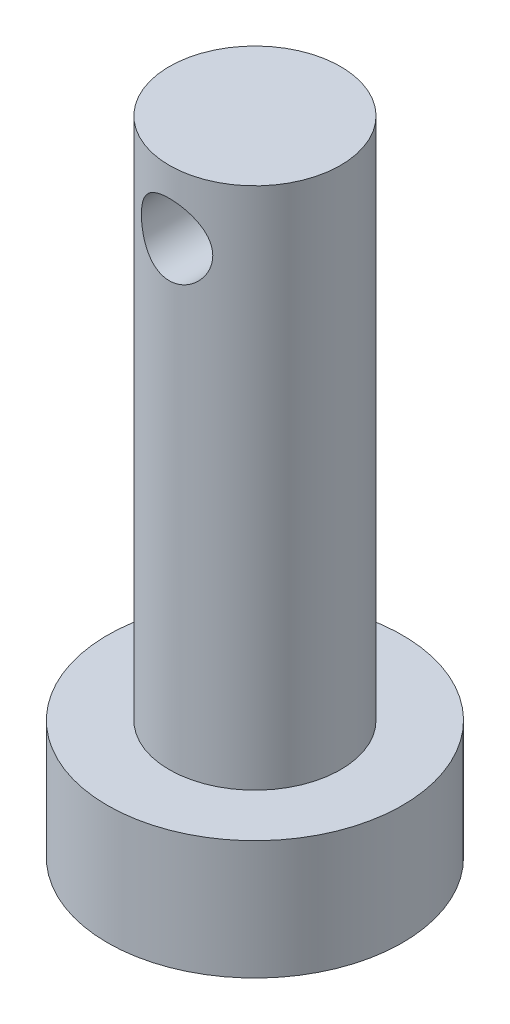
ISO-10303-21;
HEADER;
FILE_DESCRIPTION(('STEP AP214'),'2;1');
FILE_NAME('part.step','',(''),(''),'','','');
FILE_SCHEMA(('AUTOMOTIVE_DESIGN { 1 0 10303 214 1 1 1 1 }'));
ENDSEC;
DATA;
#1=APPLICATION_CONTEXT('core data for automotive mechanical design processes');
#2=APPLICATION_PROTOCOL_DEFINITION('international standard','automotive_design',2000,#1);
#3=PRODUCT_CONTEXT('',#1,'mechanical');
#4=PRODUCT('Part','Part','',(#3));
#5=PRODUCT_RELATED_PRODUCT_CATEGORY('part','',(#4));
#6=PRODUCT_DEFINITION_FORMATION('','',#4);
#7=PRODUCT_DEFINITION_CONTEXT('part definition',#1,'design');
#8=PRODUCT_DEFINITION('design','',#6,#7);
#9=PRODUCT_DEFINITION_SHAPE('','',#8);
#10=(LENGTH_UNIT() NAMED_UNIT(*) SI_UNIT(.MILLI.,.METRE.));
#11=(NAMED_UNIT(*) PLANE_ANGLE_UNIT() SI_UNIT($,.RADIAN.));
#12=(NAMED_UNIT(*) SI_UNIT($,.STERADIAN.) SOLID_ANGLE_UNIT());
#13=UNCERTAINTY_MEASURE_WITH_UNIT(LENGTH_MEASURE(1.E-05),#10,'distance_accuracy_value','');
#14=(GEOMETRIC_REPRESENTATION_CONTEXT(3) GLOBAL_UNCERTAINTY_ASSIGNED_CONTEXT((#13)) GLOBAL_UNIT_ASSIGNED_CONTEXT((#10,
#11,#12)) REPRESENTATION_CONTEXT('',''));
#15=CARTESIAN_POINT('',(0.,0.,0.));
#16=DIRECTION('',(0.,0.,1.));
#17=DIRECTION('',(1.,0.,0.));
#18=AXIS2_PLACEMENT_3D('',#15,#16,#17);
#19=CARTESIAN_POINT('',(0.,2.5,0.));
#20=DIRECTION('',(0.,-1.,0.));
#21=DIRECTION('',(0.,0.,-1.));
#22=AXIS2_PLACEMENT_3D('',#19,#20,#21);
#23=CYLINDRICAL_SURFACE('',#22,3.1);
#24=CARTESIAN_POINT('',(0.,2.5,0.));
#25=DIRECTION('',(0.,1.,0.));
#26=DIRECTION('',(0.,0.,1.));
#27=AXIS2_PLACEMENT_3D('',#24,#25,#26);
#28=CIRCLE('',#27,3.1);
#29=CARTESIAN_POINT('',(0.,2.5,3.1));
#30=VERTEX_POINT('',#29);
#31=EDGE_CURVE('E54',#30,#30,#28,.T.);
#32=ORIENTED_EDGE('',*,*,#31,.F.);
#33=EDGE_LOOP('',(#32));
#34=FACE_BOUND('',#33,.T.);
#35=CARTESIAN_POINT('',(0.,0.,0.));
#36=DIRECTION('',(0.,1.,0.));
#37=DIRECTION('',(0.,0.,1.));
#38=AXIS2_PLACEMENT_3D('',#35,#36,#37);
#39=CIRCLE('',#38,3.1);
#40=CARTESIAN_POINT('',(0.,0.,3.1));
#41=VERTEX_POINT('',#40);
#42=EDGE_CURVE('E60',#41,#41,#39,.T.);
#43=ORIENTED_EDGE('',*,*,#42,.T.);
#44=EDGE_LOOP('',(#43));
#45=FACE_BOUND('',#44,.T.);
#46=ADVANCED_FACE('F41',(#34,#45),#23,.T.);
#47=CARTESIAN_POINT('',(0.,2.5,0.));
#48=DIRECTION('',(0.,1.,0.));
#49=DIRECTION('',(0.,0.,1.));
#50=AXIS2_PLACEMENT_3D('',#47,#48,#49);
#51=PLANE('',#50);
#52=CARTESIAN_POINT('',(0.,2.5,0.));
#53=DIRECTION('',(0.,1.,0.));
#54=DIRECTION('',(0.,0.,1.));
#55=AXIS2_PLACEMENT_3D('',#52,#53,#54);
#56=CIRCLE('',#55,1.8);
#57=CARTESIAN_POINT('',(0.,2.5,1.8));
#58=VERTEX_POINT('',#57);
#59=EDGE_CURVE('E10',#58,#58,#56,.T.);
#60=ORIENTED_EDGE('',*,*,#59,.F.);
#61=EDGE_LOOP('',(#60));
#62=FACE_BOUND('',#61,.T.);
#63=ORIENTED_EDGE('',*,*,#31,.T.);
#64=EDGE_LOOP('',(#63));
#65=FACE_BOUND('',#64,.T.);
#66=ADVANCED_FACE('F92',(#62,#65),#51,.T.);
#67=CARTESIAN_POINT('',(0.,0.,0.));
#68=DIRECTION('',(0.,1.,0.));
#69=DIRECTION('',(0.,0.,1.));
#70=AXIS2_PLACEMENT_3D('',#67,#68,#69);
#71=PLANE('',#70);
#72=ORIENTED_EDGE('',*,*,#42,.F.);
#73=EDGE_LOOP('',(#72));
#74=FACE_BOUND('',#73,.T.);
#75=ADVANCED_FACE('F88',(#74),#71,.F.);
#76=CARTESIAN_POINT('',(0.,13.5,0.));
#77=DIRECTION('',(0.,-1.,0.));
#78=DIRECTION('',(0.,0.,-1.));
#79=AXIS2_PLACEMENT_3D('',#76,#77,#78);
#80=CYLINDRICAL_SURFACE('',#79,1.8);
#81=CARTESIAN_POINT('',(0.,12.9,-1.8));
#82=CARTESIAN_POINT('',(-0.0401748315817601,12.8999956769452,-1.79999675020364));
#83=CARTESIAN_POINT('',(-0.0804128382383045,12.8967528248831,-1.79863939784826));
#84=CARTESIAN_POINT('',(-0.159748422693808,12.8838965610479,-1.79334092147731));
#85=CARTESIAN_POINT('',(-0.198842745854139,12.8742665253215,-1.78939305540617));
#86=CARTESIAN_POINT('',(-0.274613240191853,12.8490533449316,-1.77933773422876));
#87=CARTESIAN_POINT('',(-0.311297114655761,12.8334903663191,-1.77323759985002));
#88=CARTESIAN_POINT('',(-0.381497854007881,12.7969363060605,-1.75947171882398));
#89=CARTESIAN_POINT('',(-0.415015674009564,12.7759468686175,-1.75180644655709));
#90=CARTESIAN_POINT('',(-0.479669042135707,12.7280226104455,-1.73524697011121));
#91=CARTESIAN_POINT('',(-0.510624760510661,12.7008592147261,-1.72631251995656));
#92=CARTESIAN_POINT('',(-0.567695892654757,12.6418413991305,-1.70839628441108));
#93=CARTESIAN_POINT('',(-0.593808757891852,12.6099845250633,-1.69941447664086));
#94=CARTESIAN_POINT('',(-0.641722426182393,12.5405839334611,-1.68192613087797));
#95=CARTESIAN_POINT('',(-0.66324784892355,12.5028375309441,-1.67346472124031));
#96=CARTESIAN_POINT('',(-0.699563643533194,12.4238560452474,-1.65861343414203));
#97=CARTESIAN_POINT('',(-0.714357485017745,12.3826227723093,-1.65222249000494));
#98=CARTESIAN_POINT('',(-0.736047589872953,12.2999077849392,-1.64267133232623));
#99=CARTESIAN_POINT('',(-0.743289947265634,12.2585337099647,-1.63937032591072));
#100=CARTESIAN_POINT('',(-0.750751259806779,12.1750360243881,-1.63596795731702));
#101=CARTESIAN_POINT('',(-0.750974088326384,12.1329128399846,-1.63586483055156));
#102=CARTESIAN_POINT('',(-0.744650702182043,12.052559963739,-1.63875071736511));
#103=CARTESIAN_POINT('',(-0.738622086673805,12.0142793420613,-1.64150329634174));
#104=CARTESIAN_POINT('',(-0.72083514609466,11.9393327453998,-1.64939089664278));
#105=CARTESIAN_POINT('',(-0.709075723723061,11.9026670811049,-1.65452637422138));
#106=CARTESIAN_POINT('',(-0.679931752365426,11.8310653782051,-1.66671710863654));
#107=CARTESIAN_POINT('',(-0.662432829235417,11.796182747452,-1.67381089169482));
#108=CARTESIAN_POINT('',(-0.622387455483375,11.7297133596719,-1.68910998684651));
#109=CARTESIAN_POINT('',(-0.599839014311727,11.6981279096319,-1.69731573677868));
#110=CARTESIAN_POINT('',(-0.548097579326301,11.6363400247603,-1.71475786126788));
#111=CARTESIAN_POINT('',(-0.518504089924515,11.6064800595687,-1.72402272842684));
#112=CARTESIAN_POINT('',(-0.454637754630906,11.5520318982245,-1.74195403867518));
#113=CARTESIAN_POINT('',(-0.420363815669073,11.5274449369847,-1.75062034126206));
#114=CARTESIAN_POINT('',(-0.347068769216026,11.4837385058302,-1.76662970133884));
#115=CARTESIAN_POINT('',(-0.307956349468608,11.4647583329096,-1.77393759926));
#116=CARTESIAN_POINT('',(-0.2267114415161,11.433767316238,-1.78613688848882));
#117=CARTESIAN_POINT('',(-0.184580636877022,11.4217526208337,-1.7910296150748));
#118=CARTESIAN_POINT('',(-0.101356868007738,11.405750404724,-1.79759784711831));
#119=CARTESIAN_POINT('',(-0.0603667711671846,11.4013032855337,-1.79945724628275));
#120=CARTESIAN_POINT('',(0.0218127932976526,11.3991922658315,-1.80033630221247));
#121=CARTESIAN_POINT('',(0.0630022002915806,11.4015264178488,-1.79935677427163));
#122=CARTESIAN_POINT('',(0.142258945404861,11.4125826508836,-1.79478730594164));
#123=CARTESIAN_POINT('',(0.180379779983631,11.4209819724583,-1.79132932370394));
#124=CARTESIAN_POINT('',(0.254629649382654,11.4434809167245,-1.78229164063449));
#125=CARTESIAN_POINT('',(0.290758431911016,11.4575812595702,-1.77671167175822));
#126=CARTESIAN_POINT('',(0.361265399921481,11.4915425854273,-1.76374962387099));
#127=CARTESIAN_POINT('',(0.395554342113194,11.5115689098876,-1.75631694881569));
#128=CARTESIAN_POINT('',(0.460407729738857,11.556632026675,-1.74044282747454));
#129=CARTESIAN_POINT('',(0.490970611561164,11.5816709109176,-1.7320009606124));
#130=CARTESIAN_POINT('',(0.549800058164559,11.6381419399634,-1.71427252737262));
#131=CARTESIAN_POINT('',(0.577746418787902,11.6699031017918,-1.70496870954617));
#132=CARTESIAN_POINT('',(0.628001907663307,11.7378127655612,-1.68710602060803));
#133=CARTESIAN_POINT('',(0.650309755713706,11.773962261103,-1.67854731896063));
#134=CARTESIAN_POINT('',(0.688895761252196,11.8503685051815,-1.66308831746393));
#135=CARTESIAN_POINT('',(0.705083509423974,11.8906764213089,-1.65621337533067));
#136=CARTESIAN_POINT('',(0.730304483709438,11.9738223562861,-1.64525013395374));
#137=CARTESIAN_POINT('',(0.739343609182126,12.01665825749,-1.64115953733451));
#138=CARTESIAN_POINT('',(0.749424482093404,12.1000912195195,-1.63657898722358));
#139=CARTESIAN_POINT('',(0.751028282478776,12.1406067973756,-1.63583610580298));
#140=CARTESIAN_POINT('',(0.747693453143475,12.2213057166847,-1.63736311806614));
#141=CARTESIAN_POINT('',(0.74275582778833,12.2614891081882,-1.63963254924184));
#142=CARTESIAN_POINT('',(0.726950428682948,12.3384556484813,-1.64669730781361));
#143=CARTESIAN_POINT('',(0.716369421428798,12.375310004078,-1.65137012907888));
#144=CARTESIAN_POINT('',(0.689857969212809,12.4467288128143,-1.66261908719513));
#145=CARTESIAN_POINT('',(0.673926021103513,12.4812926192393,-1.66919575879016));
#146=CARTESIAN_POINT('',(0.636061715612939,12.5494175375695,-1.68400172736008));
#147=CARTESIAN_POINT('',(0.613826165462901,12.582793398101,-1.69230661628208));
#148=CARTESIAN_POINT('',(0.564410443578236,12.6455160836164,-1.70942213432303));
#149=CARTESIAN_POINT('',(0.537228557343373,12.6748615053603,-1.71823293807525));
#150=CARTESIAN_POINT('',(0.476341227467294,12.7308892090108,-1.73613835710064));
#151=CARTESIAN_POINT('',(0.442304843969418,12.7572218597044,-1.74520690507075));
#152=CARTESIAN_POINT('',(0.369960047551922,12.8038196721262,-1.76196086173212));
#153=CARTESIAN_POINT('',(0.331649698767449,12.8240820689337,-1.76964563950044));
#154=CARTESIAN_POINT('',(0.252439234030772,12.8575259072639,-1.78265510017476));
#155=CARTESIAN_POINT('',(0.211592394588383,12.8708188599704,-1.78801669549178));
#156=CARTESIAN_POINT('',(0.128046253107936,12.8902237974467,-1.79592605861175));
#157=CARTESIAN_POINT('',(0.0853531901885755,12.8963582655179,-1.7984826348718));
#158=CARTESIAN_POINT('',(0.0283416491515106,12.8995998966519,-1.7998337254136));
#159=CARTESIAN_POINT('',(0.0141747568053946,12.9000015252895,-1.80000114661521));
#160=CARTESIAN_POINT('',(0.,12.9,-1.8));
#161=B_SPLINE_CURVE_WITH_KNOTS('',3,(#81,#82,#83,#84,#85,#86,#87,#88,#89,#90,#91,#92,#93,#94,
#95,#96,#97,#98,#99,#100,#101,#102,#103,#104,#105,#106,#107,#108,#109,#110,#111,#112,#113,#114,
#115,#116,#117,#118,#119,#120,#121,#122,#123,#124,#125,#126,#127,#128,#129,#130,#131,#132,#133,
#134,#135,#136,#137,#138,#139,#140,#141,#142,#143,#144,#145,#146,#147,#148,#149,#150,#151,#152,
#153,#154,#155,#156,#157,#158,#159,#160),.UNSPECIFIED.,.T.,.F.,(4,2,2,2,2,2,2,2,2,2,2,2,2,2,2,2,
2,2,2,2,2,2,2,2,2,2,2,2,2,2,2,2,2,2,2,2,2,2,2,4),(0.,0.120484151330363,0.241283124377218,
0.361675111143782,0.482030662111785,0.607907617732842,0.733850628788793,0.865990347234751,
0.998061880383526,1.12377163882534,1.24941202949428,1.36542094321534,1.48145207836328,
1.59995227835229,1.71849927430324,1.84706484676738,1.97566049588753,2.10722433036488,
2.23871534530978,2.36189066035951,2.48503060495903,2.60205953841433,2.71910325961071,
2.83978281163297,2.96051283281698,3.08987092817577,3.21925836744205,3.35048873015714,
3.48161068244748,3.60263926535786,3.72364926778522,3.83902589978858,3.95443496970368,
4.07678336038465,4.19917424055567,4.33047921002934,4.4618438965715,4.59103713491632,
4.71982350281593,4.76233353899459),.UNSPECIFIED.);
#162=CARTESIAN_POINT('',(0.,12.9,-1.8));
#163=VERTEX_POINT('',#162);
#164=EDGE_CURVE('E44',#163,#163,#161,.T.);
#165=ORIENTED_EDGE('',*,*,#164,.T.);
#166=EDGE_LOOP('',(#165));
#167=FACE_BOUND('',#166,.T.);
#168=CARTESIAN_POINT('',(0.75,12.15,1.63630681719536));
#169=CARTESIAN_POINT('',(0.749995554399406,12.1099968654619,1.63631111737932));
#170=CARTESIAN_POINT('',(0.746779223289017,12.0699284059043,1.6377951572064));
#171=CARTESIAN_POINT('',(0.734038073686708,11.9909478347657,1.6435430019053));
#172=CARTESIAN_POINT('',(0.724496124019659,11.9520391639949,1.6478143549456));
#173=CARTESIAN_POINT('',(0.699539930516705,11.8766633221854,1.65856150544861));
#174=CARTESIAN_POINT('',(0.684149624588568,11.840186901771,1.66502830537569));
#175=CARTESIAN_POINT('',(0.648003826526776,11.7703443302532,1.67942489139476));
#176=CARTESIAN_POINT('',(0.627249603549188,11.7369774459401,1.6873543312847));
#177=CARTESIAN_POINT('',(0.579584329605701,11.6722045650159,1.70433457571914));
#178=CARTESIAN_POINT('',(0.552391942910647,11.6410154647535,1.71342340847487));
#179=CARTESIAN_POINT('',(0.493213005447332,11.5834798665015,1.73138577223336));
#180=CARTESIAN_POINT('',(0.461224614824405,11.5571352356322,1.74025921908473));
#181=CARTESIAN_POINT('',(0.391658036278411,11.5089302814724,1.75725322758368));
#182=CARTESIAN_POINT('',(0.353897576210198,11.4873140231806,1.76532443985174));
#183=CARTESIAN_POINT('',(0.274879213417414,11.4508343876966,1.77933911996055));
#184=CARTESIAN_POINT('',(0.233622872923277,11.4359680128215,1.78528353208294));
#185=CARTESIAN_POINT('',(0.151061098815101,11.414196324746,1.7941051262542));
#186=CARTESIAN_POINT('',(0.10986994571765,11.4069169830588,1.7971258267648));
#187=CARTESIAN_POINT('',(0.0267475082190058,11.3993174153041,1.80028097166722));
#188=CARTESIAN_POINT('',(-0.0151834690587077,11.3989943664702,1.80041658678609));
#189=CARTESIAN_POINT('',(-0.0958756680675386,11.40512056856,1.79787077479834));
#190=CARTESIAN_POINT('',(-0.134674493164386,11.4111588603154,1.79536028789198));
#191=CARTESIAN_POINT('',(-0.210649736358872,11.4291318615829,1.78803910050185));
#192=CARTESIAN_POINT('',(-0.247826034632948,11.4410670057781,1.78322823044746));
#193=CARTESIAN_POINT('',(-0.320182870846514,11.4706368245368,1.77167911448417));
#194=CARTESIAN_POINT('',(-0.355324306244942,11.4883556777225,1.76491258275651));
#195=CARTESIAN_POINT('',(-0.422227060369177,11.5289074540202,1.75011428393883));
#196=CARTESIAN_POINT('',(-0.453987178654184,11.551742184507,1.74208206999753));
#197=CARTESIAN_POINT('',(-0.515604547024753,11.6037494522428,1.72489019266236));
#198=CARTESIAN_POINT('',(-0.545169862389743,11.6332552747674,1.71569096613606));
#199=CARTESIAN_POINT('',(-0.5990588489566,11.6968268644239,1.69762716408882));
#200=CARTESIAN_POINT('',(-0.623380497494587,11.7308943829753,1.68876271878822));
#201=CARTESIAN_POINT('',(-0.66684113550038,11.8040370219971,1.67208967413203));
#202=CARTESIAN_POINT('',(-0.685783520133242,11.843239923446,1.66432535134029));
#203=CARTESIAN_POINT('',(-0.71667859235035,11.9246886269847,1.65125906532607));
#204=CARTESIAN_POINT('',(-0.728636277763879,11.9669322289617,1.64595534200756));
#205=CARTESIAN_POINT('',(-0.744480151008727,12.0503380853484,1.63884727511834));
#206=CARTESIAN_POINT('',(-0.748839687797196,12.0913926733554,1.6368382151827));
#207=CARTESIAN_POINT('',(-0.750753783113992,12.1736870894469,1.63596172086385));
#208=CARTESIAN_POINT('',(-0.748310695908895,12.214926848515,1.63709319959591));
#209=CARTESIAN_POINT('',(-0.737120865393337,12.2936390312583,1.64215878807449));
#210=CARTESIAN_POINT('',(-0.72878771290829,12.3311836120721,1.64590882809971));
#211=CARTESIAN_POINT('',(-0.706602351385352,12.4043107778987,1.65555378178468));
#212=CARTESIAN_POINT('',(-0.692748852318749,12.4398929020984,1.66144919676096));
#213=CARTESIAN_POINT('',(-0.659265124831121,12.5097691862139,1.675024787142));
#214=CARTESIAN_POINT('',(-0.639415099837189,12.5439449847662,1.68276997321369));
#215=CARTESIAN_POINT('',(-0.594720470631584,12.6086448314994,1.69908002244476));
#216=CARTESIAN_POINT('',(-0.569873704725593,12.6391672900211,1.7076452395235));
#217=CARTESIAN_POINT('',(-0.513506673429303,12.6982800809304,1.72547171870719));
#218=CARTESIAN_POINT('',(-0.481607796887844,12.7265108399704,1.73473288025305));
#219=CARTESIAN_POINT('',(-0.413310907532125,12.7772833751876,1.75226016710354));
#220=CARTESIAN_POINT('',(-0.376912565282196,12.7998247344382,1.76052621946208));
#221=CARTESIAN_POINT('',(-0.300392808482034,12.8385539252661,1.7751855095139));
#222=CARTESIAN_POINT('',(-0.260262101783107,12.8547253447737,1.78157389883296));
#223=CARTESIAN_POINT('',(-0.177515301092652,12.8799700754007,1.7917090386202));
#224=CARTESIAN_POINT('',(-0.134900702535119,12.8890476109356,1.79545736111952));
#225=CARTESIAN_POINT('',(-0.051609920103848,12.8993148753122,1.79970920878506));
#226=CARTESIAN_POINT('',(-0.0110064508763401,12.9010115998182,1.80042122720535));
#227=CARTESIAN_POINT('',(0.0698920870285697,12.8978321152236,1.79909714088572));
#228=CARTESIAN_POINT('',(0.110187208524692,12.8929570583923,1.79706151790588));
#229=CARTESIAN_POINT('',(0.187851889469509,12.8771363567048,1.79058039589041));
#230=CARTESIAN_POINT('',(0.22527452270614,12.8664121917183,1.7862229452554));
#231=CARTESIAN_POINT('',(0.297775338300797,12.8394394516745,1.77557699908235));
#232=CARTESIAN_POINT('',(0.332853073791495,12.8231898272011,1.76928813674524));
#233=CARTESIAN_POINT('',(0.401414739287268,12.7848062824713,1.75503495239197));
#234=CARTESIAN_POINT('',(0.434754994786009,12.7624396191456,1.74700775513259));
#235=CARTESIAN_POINT('',(0.497351205383269,12.7127956902769,1.73022937124538));
#236=CARTESIAN_POINT('',(0.526605637071625,12.685516601756,1.72147791650278));
#237=CARTESIAN_POINT('',(0.582269872338948,12.6246331044874,1.70348907155484));
#238=CARTESIAN_POINT('',(0.608350652189081,12.5907245912273,1.69425913714738));
#239=CARTESIAN_POINT('',(0.654499993840046,12.5187247555919,1.67697331614112));
#240=CARTESIAN_POINT('',(0.674565194740529,12.4806311111651,1.66891808713535));
#241=CARTESIAN_POINT('',(0.707896596261463,12.4014336989864,1.65505534639585));
#242=CARTESIAN_POINT('',(0.721198941797122,12.3603473047241,1.64923592681919));
#243=CARTESIAN_POINT('',(0.740541338722807,12.2762762556896,1.6406448184));
#244=CARTESIAN_POINT('',(0.746605749127261,12.2332984756354,1.63786290962988));
#245=CARTESIAN_POINT('',(0.749642789541899,12.1767848854429,1.63646987839613));
#246=CARTESIAN_POINT('',(0.750001488726711,12.1633961055672,1.63630537716525));
#247=CARTESIAN_POINT('',(0.75,12.15,1.63630681719536));
#248=B_SPLINE_CURVE_WITH_KNOTS('',3,(#168,#169,#170,#171,#172,#173,#174,#175,#176,#177,#178,
#179,#180,#181,#182,#183,#184,#185,#186,#187,#188,#189,#190,#191,#192,#193,#194,#195,#196,#197,
#198,#199,#200,#201,#202,#203,#204,#205,#206,#207,#208,#209,#210,#211,#212,#213,#214,#215,#216,
#217,#218,#219,#220,#221,#222,#223,#224,#225,#226,#227,#228,#229,#230,#231,#232,#233,#234,#235,
#236,#237,#238,#239,#240,#241,#242,#243,#244,#245,#246,#247),.UNSPECIFIED.,.T.,.F.,(4,2,2,2,2,2,
2,2,2,2,2,2,2,2,2,2,2,2,2,2,2,2,2,2,2,2,2,2,2,2,2,2,2,2,2,2,2,2,2,4),(0.,0.119971027191309,
0.240268297105304,0.360078391291267,0.47986016313006,0.60640104858392,0.732990602759461,
0.865070859467542,0.997092400649345,1.12224363586771,1.24734408550758,1.36483104147056,
1.4823266592113,1.60161488784039,1.7209453261349,1.84868719106691,1.9764782426482,
2.10846927400033,2.24036574447341,2.36370466983784,2.48700091511069,2.60240340639715,
2.71783288148118,2.83815076090901,2.95852080477279,3.08868997641308,3.2188686842512,
3.34938063573357,3.47981480785805,3.60113181056432,3.72242754481149,3.83942049021893,
3.95643566779304,4.07873917697422,4.20108816629343,4.33176256144846,4.46250982883513,
4.59255075478119,4.72215278727698,4.76232825262024),.UNSPECIFIED.);
#249=CARTESIAN_POINT('',(0.75,12.15,1.63630681719536));
#250=VERTEX_POINT('',#249);
#251=EDGE_CURVE('E67',#250,#250,#248,.T.);
#252=ORIENTED_EDGE('',*,*,#251,.T.);
#253=EDGE_LOOP('',(#252));
#254=FACE_BOUND('',#253,.T.);
#255=CARTESIAN_POINT('',(0.,13.5,0.));
#256=DIRECTION('',(0.,1.,0.));
#257=DIRECTION('',(0.,0.,1.));
#258=AXIS2_PLACEMENT_3D('',#255,#256,#257);
#259=CIRCLE('',#258,1.8);
#260=CARTESIAN_POINT('',(0.,13.5,1.8));
#261=VERTEX_POINT('',#260);
#262=EDGE_CURVE('E63',#261,#261,#259,.T.);
#263=ORIENTED_EDGE('',*,*,#262,.F.);
#264=EDGE_LOOP('',(#263));
#265=FACE_BOUND('',#264,.T.);
#266=ORIENTED_EDGE('',*,*,#59,.T.);
#267=EDGE_LOOP('',(#266));
#268=FACE_BOUND('',#267,.T.);
#269=ADVANCED_FACE('F73',(#167,#254,#265,#268),#80,.T.);
#270=CARTESIAN_POINT('',(0.,13.5,0.));
#271=DIRECTION('',(0.,1.,0.));
#272=DIRECTION('',(0.,0.,1.));
#273=AXIS2_PLACEMENT_3D('',#270,#271,#272);
#274=PLANE('',#273);
#275=ORIENTED_EDGE('',*,*,#262,.T.);
#276=EDGE_LOOP('',(#275));
#277=FACE_BOUND('',#276,.T.);
#278=ADVANCED_FACE('F80',(#277),#274,.T.);
#279=CARTESIAN_POINT('',(0.,12.15,-3.1));
#280=DIRECTION('',(0.,0.,1.));
#281=DIRECTION('',(1.,0.,0.));
#282=AXIS2_PLACEMENT_3D('',#279,#280,#281);
#283=CYLINDRICAL_SURFACE('',#282,0.75);
#284=ORIENTED_EDGE('',*,*,#251,.F.);
#285=EDGE_LOOP('',(#284));
#286=FACE_BOUND('',#285,.T.);
#287=ORIENTED_EDGE('',*,*,#164,.F.);
#288=EDGE_LOOP('',(#287));
#289=FACE_BOUND('',#288,.T.);
#290=ADVANCED_FACE('F77',(#286,#289),#283,.F.);
#291=CLOSED_SHELL('',(#46,#66,#75,#269,#278,#290));
#292=MANIFOLD_SOLID_BREP('B2',#291);
#293=ADVANCED_BREP_SHAPE_REPRESENTATION('',(#18,#292),#14);
#294=SHAPE_DEFINITION_REPRESENTATION(#9,#293);
ENDSEC;
END-ISO-10303-21;
